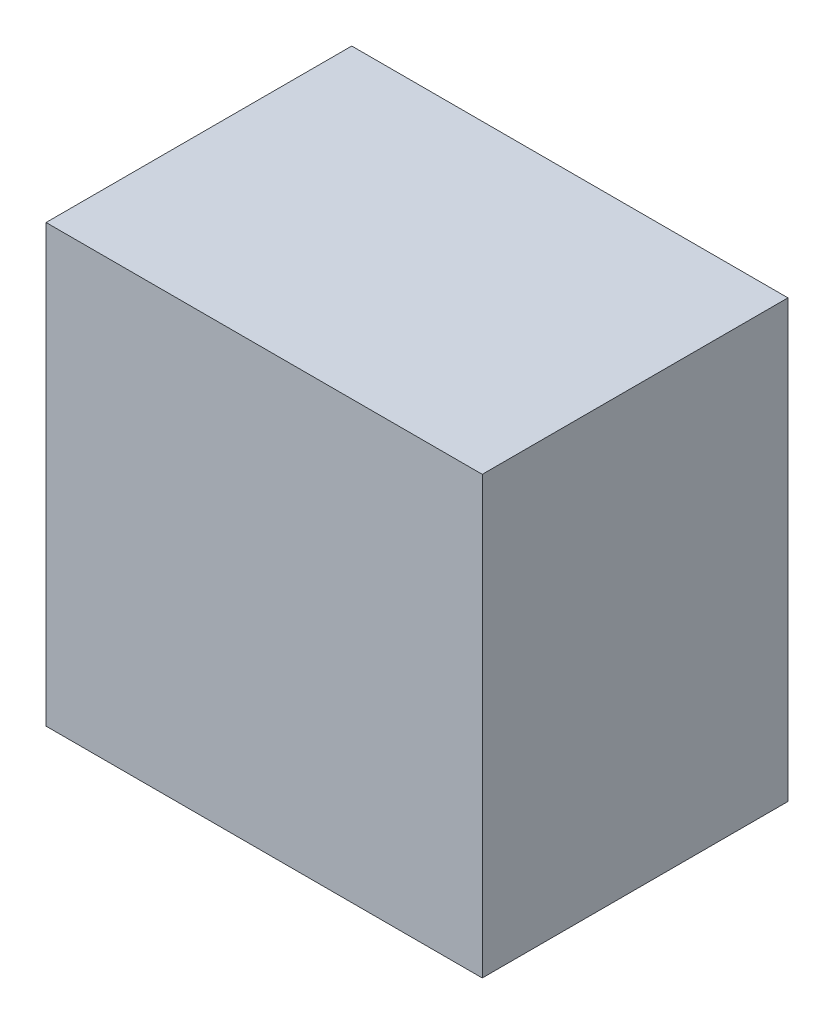
ISO-10303-21;
HEADER;
FILE_DESCRIPTION(('STEP AP214'),'2;1');
FILE_NAME('part.step','',(''),(''),'','','');
FILE_SCHEMA(('AUTOMOTIVE_DESIGN { 1 0 10303 214 1 1 1 1 }'));
ENDSEC;
DATA;
#1=APPLICATION_CONTEXT('core data for automotive mechanical design processes');
#2=APPLICATION_PROTOCOL_DEFINITION('international standard','automotive_design',2000,#1);
#3=PRODUCT_CONTEXT('',#1,'mechanical');
#4=PRODUCT('Part','Part','',(#3));
#5=PRODUCT_RELATED_PRODUCT_CATEGORY('part','',(#4));
#6=PRODUCT_DEFINITION_FORMATION('','',#4);
#7=PRODUCT_DEFINITION_CONTEXT('part definition',#1,'design');
#8=PRODUCT_DEFINITION('design','',#6,#7);
#9=PRODUCT_DEFINITION_SHAPE('','',#8);
#10=(LENGTH_UNIT() NAMED_UNIT(*) SI_UNIT(.MILLI.,.METRE.));
#11=(NAMED_UNIT(*) PLANE_ANGLE_UNIT() SI_UNIT($,.RADIAN.));
#12=(NAMED_UNIT(*) SI_UNIT($,.STERADIAN.) SOLID_ANGLE_UNIT());
#13=UNCERTAINTY_MEASURE_WITH_UNIT(LENGTH_MEASURE(1.E-05),#10,'distance_accuracy_value','');
#14=(GEOMETRIC_REPRESENTATION_CONTEXT(3) GLOBAL_UNCERTAINTY_ASSIGNED_CONTEXT((#13)) GLOBAL_UNIT_ASSIGNED_CONTEXT((#10,
#11,#12)) REPRESENTATION_CONTEXT('',''));
#15=CARTESIAN_POINT('',(0.,0.,0.));
#16=DIRECTION('',(0.,0.,1.));
#17=DIRECTION('',(1.,0.,0.));
#18=AXIS2_PLACEMENT_3D('',#15,#16,#17);
#19=CARTESIAN_POINT('',(0.,0.,1.78));
#20=DIRECTION('',(0.,0.,1.));
#21=DIRECTION('',(1.,0.,0.));
#22=AXIS2_PLACEMENT_3D('',#19,#20,#21);
#23=PLANE('',#22);
#24=DIRECTION('',(0.,1.,0.));
#25=VECTOR('',#24,1.);
#26=CARTESIAN_POINT('',(0.,0.,1.78));
#27=LINE('',#26,#25);
#28=CARTESIAN_POINT('',(0.,0.,1.78));
#29=VERTEX_POINT('',#28);
#30=CARTESIAN_POINT('',(0.,2.54,1.78));
#31=VERTEX_POINT('',#30);
#32=EDGE_CURVE('E88',#29,#31,#27,.T.);
#33=ORIENTED_EDGE('',*,*,#32,.F.);
#34=DIRECTION('',(1.,0.,0.));
#35=VECTOR('',#34,1.);
#36=CARTESIAN_POINT('',(0.,0.,1.78));
#37=LINE('',#36,#35);
#38=CARTESIAN_POINT('',(2.54,0.,1.78));
#39=VERTEX_POINT('',#38);
#40=EDGE_CURVE('E108',#29,#39,#37,.T.);
#41=ORIENTED_EDGE('',*,*,#40,.T.);
#42=DIRECTION('',(0.,1.,0.));
#43=VECTOR('',#42,1.);
#44=CARTESIAN_POINT('',(2.54,0.,1.78));
#45=LINE('',#44,#43);
#46=CARTESIAN_POINT('',(2.54,2.54,1.78));
#47=VERTEX_POINT('',#46);
#48=EDGE_CURVE('E105',#39,#47,#45,.T.);
#49=ORIENTED_EDGE('',*,*,#48,.T.);
#50=DIRECTION('',(1.,0.,0.));
#51=VECTOR('',#50,1.);
#52=CARTESIAN_POINT('',(0.,2.54,1.78));
#53=LINE('',#52,#51);
#54=EDGE_CURVE('E11',#31,#47,#53,.T.);
#55=ORIENTED_EDGE('',*,*,#54,.F.);
#56=EDGE_LOOP('',(#33,#41,#49,#55));
#57=FACE_BOUND('',#56,.T.);
#58=ADVANCED_FACE('F17',(#57),#23,.T.);
#59=CARTESIAN_POINT('',(0.,0.,0.));
#60=DIRECTION('',(0.,0.,1.));
#61=DIRECTION('',(1.,0.,0.));
#62=AXIS2_PLACEMENT_3D('',#59,#60,#61);
#63=PLANE('',#62);
#64=DIRECTION('',(1.,0.,0.));
#65=VECTOR('',#64,1.);
#66=CARTESIAN_POINT('',(0.,2.54,0.));
#67=LINE('',#66,#65);
#68=CARTESIAN_POINT('',(0.,2.54,0.));
#69=VERTEX_POINT('',#68);
#70=CARTESIAN_POINT('',(2.54,2.54,0.));
#71=VERTEX_POINT('',#70);
#72=EDGE_CURVE('E20',#69,#71,#67,.T.);
#73=ORIENTED_EDGE('',*,*,#72,.T.);
#74=DIRECTION('',(0.,1.,0.));
#75=VECTOR('',#74,1.);
#76=CARTESIAN_POINT('',(2.54,0.,0.));
#77=LINE('',#76,#75);
#78=CARTESIAN_POINT('',(2.54,0.,0.));
#79=VERTEX_POINT('',#78);
#80=EDGE_CURVE('E102',#79,#71,#77,.T.);
#81=ORIENTED_EDGE('',*,*,#80,.F.);
#82=DIRECTION('',(1.,0.,0.));
#83=VECTOR('',#82,1.);
#84=CARTESIAN_POINT('',(0.,0.,0.));
#85=LINE('',#84,#83);
#86=CARTESIAN_POINT('',(0.,0.,0.));
#87=VERTEX_POINT('',#86);
#88=EDGE_CURVE('E76',#87,#79,#85,.T.);
#89=ORIENTED_EDGE('',*,*,#88,.F.);
#90=DIRECTION('',(0.,1.,0.));
#91=VECTOR('',#90,1.);
#92=CARTESIAN_POINT('',(0.,0.,0.));
#93=LINE('',#92,#91);
#94=EDGE_CURVE('E78',#87,#69,#93,.T.);
#95=ORIENTED_EDGE('',*,*,#94,.T.);
#96=EDGE_LOOP('',(#73,#81,#89,#95));
#97=FACE_BOUND('',#96,.T.);
#98=ADVANCED_FACE('F79',(#97),#63,.F.);
#99=CARTESIAN_POINT('',(0.,2.54,0.));
#100=DIRECTION('',(0.,1.,0.));
#101=DIRECTION('',(1.,0.,0.));
#102=AXIS2_PLACEMENT_3D('',#99,#100,#101);
#103=PLANE('',#102);
#104=ORIENTED_EDGE('',*,*,#72,.F.);
#105=DIRECTION('',(0.,0.,1.));
#106=VECTOR('',#105,1.);
#107=CARTESIAN_POINT('',(0.,2.54,0.));
#108=LINE('',#107,#106);
#109=EDGE_CURVE('E70',#69,#31,#108,.T.);
#110=ORIENTED_EDGE('',*,*,#109,.T.);
#111=ORIENTED_EDGE('',*,*,#54,.T.);
#112=DIRECTION('',(0.,0.,1.));
#113=VECTOR('',#112,1.);
#114=CARTESIAN_POINT('',(2.54,2.54,0.));
#115=LINE('',#114,#113);
#116=EDGE_CURVE('E73',#71,#47,#115,.T.);
#117=ORIENTED_EDGE('',*,*,#116,.F.);
#118=EDGE_LOOP('',(#104,#110,#111,#117));
#119=FACE_BOUND('',#118,.T.);
#120=ADVANCED_FACE('F68',(#119),#103,.T.);
#121=CARTESIAN_POINT('',(0.,0.,0.));
#122=DIRECTION('',(0.,1.,0.));
#123=DIRECTION('',(1.,0.,0.));
#124=AXIS2_PLACEMENT_3D('',#121,#122,#123);
#125=PLANE('',#124);
#126=DIRECTION('',(0.,0.,1.));
#127=VECTOR('',#126,1.);
#128=CARTESIAN_POINT('',(2.54,0.,0.));
#129=LINE('',#128,#127);
#130=EDGE_CURVE('E98',#79,#39,#129,.T.);
#131=ORIENTED_EDGE('',*,*,#130,.T.);
#132=ORIENTED_EDGE('',*,*,#40,.F.);
#133=DIRECTION('',(0.,0.,1.));
#134=VECTOR('',#133,1.);
#135=CARTESIAN_POINT('',(0.,0.,0.));
#136=LINE('',#135,#134);
#137=EDGE_CURVE('E84',#87,#29,#136,.T.);
#138=ORIENTED_EDGE('',*,*,#137,.F.);
#139=ORIENTED_EDGE('',*,*,#88,.T.);
#140=EDGE_LOOP('',(#131,#132,#138,#139));
#141=FACE_BOUND('',#140,.T.);
#142=ADVANCED_FACE('F116',(#141),#125,.F.);
#143=CARTESIAN_POINT('',(2.54,0.,0.));
#144=DIRECTION('',(1.,0.,0.));
#145=DIRECTION('',(0.,1.,0.));
#146=AXIS2_PLACEMENT_3D('',#143,#144,#145);
#147=PLANE('',#146);
#148=ORIENTED_EDGE('',*,*,#130,.F.);
#149=ORIENTED_EDGE('',*,*,#80,.T.);
#150=ORIENTED_EDGE('',*,*,#116,.T.);
#151=ORIENTED_EDGE('',*,*,#48,.F.);
#152=EDGE_LOOP('',(#148,#149,#150,#151));
#153=FACE_BOUND('',#152,.T.);
#154=ADVANCED_FACE('F120',(#153),#147,.T.);
#155=CARTESIAN_POINT('',(0.,0.,0.));
#156=DIRECTION('',(1.,0.,0.));
#157=DIRECTION('',(0.,1.,0.));
#158=AXIS2_PLACEMENT_3D('',#155,#156,#157);
#159=PLANE('',#158);
#160=ORIENTED_EDGE('',*,*,#32,.T.);
#161=ORIENTED_EDGE('',*,*,#109,.F.);
#162=ORIENTED_EDGE('',*,*,#94,.F.);
#163=ORIENTED_EDGE('',*,*,#137,.T.);
#164=EDGE_LOOP('',(#160,#161,#162,#163));
#165=FACE_BOUND('',#164,.T.);
#166=ADVANCED_FACE('F86',(#165),#159,.F.);
#167=CLOSED_SHELL('',(#58,#98,#120,#142,#154,#166));
#168=MANIFOLD_SOLID_BREP('B1',#167);
#169=ADVANCED_BREP_SHAPE_REPRESENTATION('',(#18,#168),#14);
#170=SHAPE_DEFINITION_REPRESENTATION(#9,#169);
ENDSEC;
END-ISO-10303-21;
